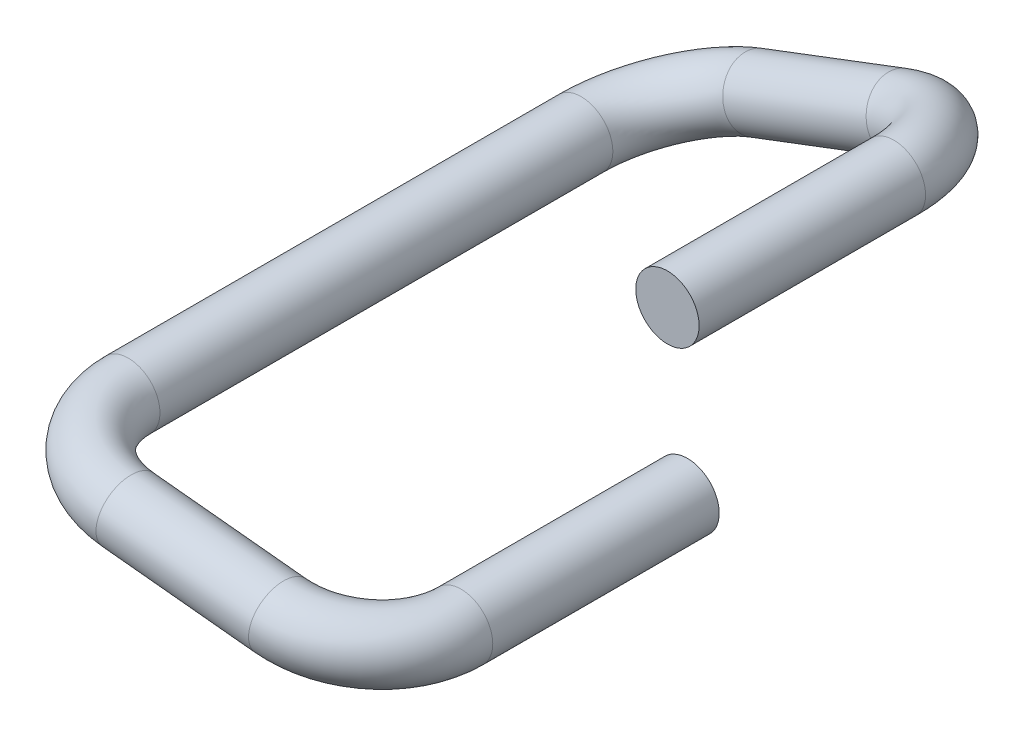
ISO-10303-21;
HEADER;
FILE_DESCRIPTION(('STEP AP214'),'2;1');
FILE_NAME('part.step','',(''),(''),'','','');
FILE_SCHEMA(('AUTOMOTIVE_DESIGN { 1 0 10303 214 1 1 1 1 }'));
ENDSEC;
DATA;
#1=APPLICATION_CONTEXT('core data for automotive mechanical design processes');
#2=APPLICATION_PROTOCOL_DEFINITION('international standard','automotive_design',2000,#1);
#3=PRODUCT_CONTEXT('',#1,'mechanical');
#4=PRODUCT('Part','Part','',(#3));
#5=PRODUCT_RELATED_PRODUCT_CATEGORY('part','',(#4));
#6=PRODUCT_DEFINITION_FORMATION('','',#4);
#7=PRODUCT_DEFINITION_CONTEXT('part definition',#1,'design');
#8=PRODUCT_DEFINITION('design','',#6,#7);
#9=PRODUCT_DEFINITION_SHAPE('','',#8);
#10=(LENGTH_UNIT() NAMED_UNIT(*) SI_UNIT(.MILLI.,.METRE.));
#11=(NAMED_UNIT(*) PLANE_ANGLE_UNIT() SI_UNIT($,.RADIAN.));
#12=(NAMED_UNIT(*) SI_UNIT($,.STERADIAN.) SOLID_ANGLE_UNIT());
#13=UNCERTAINTY_MEASURE_WITH_UNIT(LENGTH_MEASURE(1.E-05),#10,'distance_accuracy_value','');
#14=(GEOMETRIC_REPRESENTATION_CONTEXT(3) GLOBAL_UNCERTAINTY_ASSIGNED_CONTEXT((#13)) GLOBAL_UNIT_ASSIGNED_CONTEXT((#10,
#11,#12)) REPRESENTATION_CONTEXT('',''));
#15=CARTESIAN_POINT('',(0.,0.,0.));
#16=DIRECTION('',(0.,0.,1.));
#17=DIRECTION('',(1.,0.,0.));
#18=AXIS2_PLACEMENT_3D('',#15,#16,#17);
#19=CARTESIAN_POINT('',(6.27851787087894,1.68232379316638,0.));
#20=DIRECTION('',(0.,0.,1.));
#21=DIRECTION('',(1.,0.,0.));
#22=AXIS2_PLACEMENT_3D('',#19,#20,#21);
#23=PLANE('',#22);
#24=CARTESIAN_POINT('',(6.27851787087894,1.68232379316638,0.));
#25=DIRECTION('',(0.,0.,1.));
#26=DIRECTION('',(0.,-1.,0.));
#27=AXIS2_PLACEMENT_3D('',#24,#25,#26);
#28=CIRCLE('',#27,0.35);
#29=CARTESIAN_POINT('',(6.27851787087894,1.33232379316638,0.));
#30=VERTEX_POINT('',#29);
#31=EDGE_CURVE('E18',#30,#30,#28,.F.);
#32=ORIENTED_EDGE('',*,*,#31,.F.);
#33=EDGE_LOOP('',(#32));
#34=FACE_BOUND('',#33,.T.);
#35=ADVANCED_FACE('F15',(#34),#23,.T.);
#36=CARTESIAN_POINT('',(6.5,0.,0.));
#37=DIRECTION('',(0.,0.,1.));
#38=DIRECTION('',(1.,0.,0.));
#39=AXIS2_PLACEMENT_3D('',#36,#37,#38);
#40=PLANE('',#39);
#41=CARTESIAN_POINT('',(6.5,0.,0.));
#42=DIRECTION('',(0.,0.,1.));
#43=DIRECTION('',(0.,-1.,0.));
#44=AXIS2_PLACEMENT_3D('',#41,#42,#43);
#45=CIRCLE('',#44,0.35);
#46=CARTESIAN_POINT('',(6.5,-0.35,0.));
#47=VERTEX_POINT('',#46);
#48=EDGE_CURVE('E77',#47,#47,#45,.T.);
#49=ORIENTED_EDGE('',*,*,#48,.F.);
#50=EDGE_LOOP('',(#49));
#51=FACE_BOUND('',#50,.T.);
#52=ADVANCED_FACE('F87',(#51),#40,.F.);
#53=CARTESIAN_POINT('',(6.27851787087894,1.68232379316638,-2.49999999999999));
#54=DIRECTION('',(0.,0.,1.));
#55=DIRECTION('',(0.,-1.,0.));
#56=AXIS2_PLACEMENT_3D('',#53,#54,#55);
#57=CYLINDRICAL_SURFACE('',#56,0.35);
#58=CARTESIAN_POINT('',(6.27851787087894,1.68232379316638,-2.49999999999998));
#59=DIRECTION('',(0.,0.,1.));
#60=DIRECTION('',(0.934943333045711,0.354797074386721,0.));
#61=AXIS2_PLACEMENT_3D('',#58,#59,#60);
#62=CIRCLE('',#61,0.35);
#63=CARTESIAN_POINT('',(6.60574803744494,1.80650276920173,-2.49999999999998));
#64=VERTEX_POINT('',#63);
#65=EDGE_CURVE('E75',#64,#64,#62,.F.);
#66=ORIENTED_EDGE('',*,*,#65,.F.);
#67=EDGE_LOOP('',(#66));
#68=FACE_BOUND('',#67,.T.);
#69=ORIENTED_EDGE('',*,*,#31,.T.);
#70=EDGE_LOOP('',(#69));
#71=FACE_BOUND('',#70,.T.);
#72=ADVANCED_FACE('F84',(#68,#71),#57,.T.);
#73=CARTESIAN_POINT('',(6.5,0.,0.));
#74=DIRECTION('',(0.,0.,1.));
#75=DIRECTION('',(0.,-1.,0.));
#76=AXIS2_PLACEMENT_3D('',#73,#74,#75);
#77=CYLINDRICAL_SURFACE('',#76,0.35);
#78=ORIENTED_EDGE('',*,*,#48,.T.);
#79=EDGE_LOOP('',(#78));
#80=FACE_BOUND('',#79,.T.);
#81=CARTESIAN_POINT('',(6.5,0.,2.5));
#82=DIRECTION('',(0.,0.,1.));
#83=DIRECTION('',(0.994914151503573,-0.100726516558078,0.));
#84=AXIS2_PLACEMENT_3D('',#81,#82,#83);
#85=CIRCLE('',#84,0.35);
#86=CARTESIAN_POINT('',(6.84821995302625,-0.0352542807953274,2.5));
#87=VERTEX_POINT('',#86);
#88=EDGE_CURVE('E57',#87,#87,#85,.T.);
#89=ORIENTED_EDGE('',*,*,#88,.F.);
#90=EDGE_LOOP('',(#89));
#91=FACE_BOUND('',#90,.T.);
#92=ADVANCED_FACE('F70',(#80,#91),#77,.T.);
#93=CARTESIAN_POINT('',(5.34357453783323,1.32752671877966,-2.5));
#94=DIRECTION('',(0.354797074386721,-0.934943333045711,0.));
#95=DIRECTION('',(0.,0.,-1.));
#96=AXIS2_PLACEMENT_3D('',#93,#94,#95);
#97=TOROIDAL_SURFACE('',#96,1.,0.35);
#98=CARTESIAN_POINT('',(5.34357453783324,1.32752671877966,-3.5));
#99=DIRECTION('',(0.934943333045712,0.35479707438672,0.));
#100=DIRECTION('',(-0.35479707438672,0.934943333045712,0.));
#101=AXIS2_PLACEMENT_3D('',#98,#99,#100);
#102=CIRCLE('',#101,0.35);
#103=CARTESIAN_POINT('',(5.21939556179789,1.65475688534566,-3.5));
#104=VERTEX_POINT('',#103);
#105=EDGE_CURVE('E54',#104,#104,#102,.F.);
#106=ORIENTED_EDGE('',*,*,#105,.F.);
#107=EDGE_LOOP('',(#106));
#108=FACE_BOUND('',#107,.T.);
#109=ORIENTED_EDGE('',*,*,#65,.T.);
#110=EDGE_LOOP('',(#109));
#111=FACE_BOUND('',#110,.T.);
#112=ADVANCED_FACE('F66',(#108,#111),#97,.T.);
#113=CARTESIAN_POINT('',(5.50508584849643,0.100726516558078,2.5));
#114=DIRECTION('',(-0.100726516558078,-0.994914151503573,0.));
#115=DIRECTION('',(0.,0.,-1.));
#116=AXIS2_PLACEMENT_3D('',#113,#114,#115);
#117=TOROIDAL_SURFACE('',#116,1.,0.35);
#118=ORIENTED_EDGE('',*,*,#88,.T.);
#119=EDGE_LOOP('',(#118));
#120=FACE_BOUND('',#119,.T.);
#121=CARTESIAN_POINT('',(5.50508584849642,0.100726516558079,3.5));
#122=DIRECTION('',(-0.994914151503573,0.100726516558078,0.));
#123=DIRECTION('',(-0.100726516558078,-0.994914151503573,0.));
#124=AXIS2_PLACEMENT_3D('',#121,#122,#123);
#125=CIRCLE('',#124,0.35);
#126=CARTESIAN_POINT('',(5.4698315677011,-0.247493436468172,3.5));
#127=VERTEX_POINT('',#126);
#128=EDGE_CURVE('E51',#127,#127,#125,.T.);
#129=ORIENTED_EDGE('',*,*,#128,.F.);
#130=EDGE_LOOP('',(#129));
#131=FACE_BOUND('',#130,.T.);
#132=ADVANCED_FACE('F62',(#120,#131),#117,.T.);
#133=CARTESIAN_POINT('',(3.76056118796108,0.726796722213867,-3.5));
#134=DIRECTION('',(0.934943333045712,0.35479707438672,0.));
#135=DIRECTION('',(-0.35479707438672,0.934943333045712,0.));
#136=AXIS2_PLACEMENT_3D('',#133,#134,#135);
#137=CYLINDRICAL_SURFACE('',#136,0.35);
#138=CARTESIAN_POINT('',(3.76056118796107,0.726796722213867,-3.5));
#139=DIRECTION('',(0.934943333045711,0.354797074386721,0.));
#140=DIRECTION('',(0.,0.,-1.));
#141=AXIS2_PLACEMENT_3D('',#138,#139,#140);
#142=CIRCLE('',#141,0.35);
#143=CARTESIAN_POINT('',(3.76056118796107,0.726796722213867,-3.85));
#144=VERTEX_POINT('',#143);
#145=EDGE_CURVE('E48',#144,#144,#142,.F.);
#146=ORIENTED_EDGE('',*,*,#145,.F.);
#147=EDGE_LOOP('',(#146));
#148=FACE_BOUND('',#147,.T.);
#149=ORIENTED_EDGE('',*,*,#105,.T.);
#150=EDGE_LOOP('',(#149));
#151=FACE_BOUND('',#150,.T.);
#152=ADVANCED_FACE('F65',(#148,#151),#137,.T.);
#153=CARTESIAN_POINT('',(5.50508584849643,0.100726516558078,3.5));
#154=DIRECTION('',(-0.994914151503573,0.100726516558078,0.));
#155=DIRECTION('',(-0.100726516558078,-0.994914151503573,0.));
#156=AXIS2_PLACEMENT_3D('',#153,#154,#155);
#157=CYLINDRICAL_SURFACE('',#156,0.35);
#158=ORIENTED_EDGE('',*,*,#128,.T.);
#159=EDGE_LOOP('',(#158));
#160=FACE_BOUND('',#159,.T.);
#161=CARTESIAN_POINT('',(3.82053200641894,0.271273131269069,3.5));
#162=DIRECTION('',(-0.994914151503573,0.100726516558078,0.));
#163=DIRECTION('',(0.,0.,1.));
#164=AXIS2_PLACEMENT_3D('',#161,#162,#163);
#165=CIRCLE('',#164,0.35);
#166=CARTESIAN_POINT('',(3.82053200641894,0.271273131269068,3.85));
#167=VERTEX_POINT('',#166);
#168=EDGE_CURVE('E27',#167,#167,#165,.T.);
#169=ORIENTED_EDGE('',*,*,#168,.F.);
#170=EDGE_LOOP('',(#169));
#171=FACE_BOUND('',#170,.T.);
#172=ADVANCED_FACE('F43',(#160,#171),#157,.T.);
#173=CARTESIAN_POINT('',(3.76056118796107,0.726796722213867,-2.5));
#174=DIRECTION('',(0.354797074386721,-0.934943333045711,0.));
#175=DIRECTION('',(0.,0.,-1.));
#176=AXIS2_PLACEMENT_3D('',#173,#174,#175);
#177=TOROIDAL_SURFACE('',#176,1.,0.35);
#178=CARTESIAN_POINT('',(2.82561785491536,0.371999647827147,-2.5));
#179=DIRECTION('',(0.,0.,-1.));
#180=DIRECTION('',(0.,1.,0.));
#181=AXIS2_PLACEMENT_3D('',#178,#179,#180);
#182=CIRCLE('',#181,0.35);
#183=CARTESIAN_POINT('',(2.82561785491536,0.721999647827147,-2.5));
#184=VERTEX_POINT('',#183);
#185=EDGE_CURVE('E22',#184,#184,#182,.F.);
#186=ORIENTED_EDGE('',*,*,#185,.F.);
#187=EDGE_LOOP('',(#186));
#188=FACE_BOUND('',#187,.T.);
#189=ORIENTED_EDGE('',*,*,#145,.T.);
#190=EDGE_LOOP('',(#189));
#191=FACE_BOUND('',#190,.T.);
#192=ADVANCED_FACE('F39',(#188,#191),#177,.T.);
#193=CARTESIAN_POINT('',(3.82053200641893,0.271273131269069,2.5));
#194=DIRECTION('',(-0.100726516558078,-0.994914151503573,0.));
#195=DIRECTION('',(0.,0.,-1.));
#196=AXIS2_PLACEMENT_3D('',#193,#194,#195);
#197=TOROIDAL_SURFACE('',#196,1.,0.35);
#198=ORIENTED_EDGE('',*,*,#168,.T.);
#199=EDGE_LOOP('',(#198));
#200=FACE_BOUND('',#199,.T.);
#201=CARTESIAN_POINT('',(2.82561785491536,0.371999647827147,2.5));
#202=DIRECTION('',(0.,0.,-1.));
#203=DIRECTION('',(0.,1.,0.));
#204=AXIS2_PLACEMENT_3D('',#201,#202,#203);
#205=CIRCLE('',#204,0.35);
#206=CARTESIAN_POINT('',(2.82561785491536,0.721999647827147,2.5));
#207=VERTEX_POINT('',#206);
#208=EDGE_CURVE('E10',#207,#207,#205,.T.);
#209=ORIENTED_EDGE('',*,*,#208,.F.);
#210=EDGE_LOOP('',(#209));
#211=FACE_BOUND('',#210,.T.);
#212=ADVANCED_FACE('F34',(#200,#211),#197,.T.);
#213=CARTESIAN_POINT('',(2.82561785491536,0.371999647827147,2.5));
#214=DIRECTION('',(0.,0.,-1.));
#215=DIRECTION('',(0.,1.,0.));
#216=AXIS2_PLACEMENT_3D('',#213,#214,#215);
#217=CYLINDRICAL_SURFACE('',#216,0.35);
#218=ORIENTED_EDGE('',*,*,#208,.T.);
#219=EDGE_LOOP('',(#218));
#220=FACE_BOUND('',#219,.T.);
#221=ORIENTED_EDGE('',*,*,#185,.T.);
#222=EDGE_LOOP('',(#221));
#223=FACE_BOUND('',#222,.T.);
#224=ADVANCED_FACE('F38',(#220,#223),#217,.T.);
#225=CLOSED_SHELL('',(#35,#52,#72,#92,#112,#132,#152,#172,#192,#212,#224));
#226=MANIFOLD_SOLID_BREP('B1',#225);
#227=ADVANCED_BREP_SHAPE_REPRESENTATION('',(#18,#226),#14);
#228=SHAPE_DEFINITION_REPRESENTATION(#9,#227);
ENDSEC;
END-ISO-10303-21;
